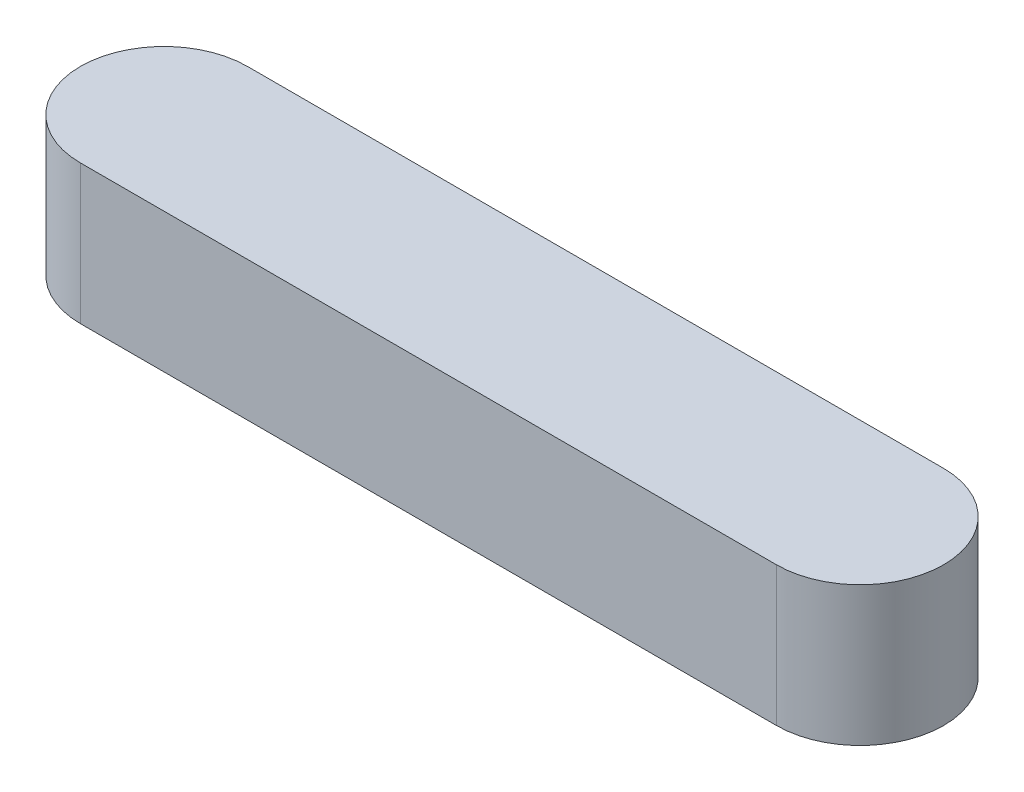
ISO-10303-21;
HEADER;
FILE_DESCRIPTION(('STEP AP214'),'2;1');
FILE_NAME('part.step','',(''),(''),'','','');
FILE_SCHEMA(('AUTOMOTIVE_DESIGN { 1 0 10303 214 1 1 1 1 }'));
ENDSEC;
DATA;
#1=APPLICATION_CONTEXT('core data for automotive mechanical design processes');
#2=APPLICATION_PROTOCOL_DEFINITION('international standard','automotive_design',2000,#1);
#3=PRODUCT_CONTEXT('',#1,'mechanical');
#4=PRODUCT('Part','Part','',(#3));
#5=PRODUCT_RELATED_PRODUCT_CATEGORY('part','',(#4));
#6=PRODUCT_DEFINITION_FORMATION('','',#4);
#7=PRODUCT_DEFINITION_CONTEXT('part definition',#1,'design');
#8=PRODUCT_DEFINITION('design','',#6,#7);
#9=PRODUCT_DEFINITION_SHAPE('','',#8);
#10=(LENGTH_UNIT() NAMED_UNIT(*) SI_UNIT(.MILLI.,.METRE.));
#11=(NAMED_UNIT(*) PLANE_ANGLE_UNIT() SI_UNIT($,.RADIAN.));
#12=(NAMED_UNIT(*) SI_UNIT($,.STERADIAN.) SOLID_ANGLE_UNIT());
#13=UNCERTAINTY_MEASURE_WITH_UNIT(LENGTH_MEASURE(1.E-05),#10,'distance_accuracy_value','');
#14=(GEOMETRIC_REPRESENTATION_CONTEXT(3) GLOBAL_UNCERTAINTY_ASSIGNED_CONTEXT((#13)) GLOBAL_UNIT_ASSIGNED_CONTEXT((#10,
#11,#12)) REPRESENTATION_CONTEXT('',''));
#15=CARTESIAN_POINT('',(0.,0.,0.));
#16=DIRECTION('',(0.,0.,1.));
#17=DIRECTION('',(1.,0.,0.));
#18=AXIS2_PLACEMENT_3D('',#15,#16,#17);
#19=CARTESIAN_POINT('',(-21.1780526384952,5.00000000000004,12.7728596341905));
#20=DIRECTION('',(0.,-1.,0.));
#21=DIRECTION('',(0.,0.,-1.));
#22=AXIS2_PLACEMENT_3D('',#19,#20,#21);
#23=CYLINDRICAL_SURFACE('',#22,3.);
#24=CARTESIAN_POINT('',(-21.1780526384952,0.,12.7728596341905));
#25=DIRECTION('',(0.,-1.,0.));
#26=DIRECTION('',(0.,0.,-1.));
#27=AXIS2_PLACEMENT_3D('',#24,#25,#26);
#28=CIRCLE('',#27,3.);
#29=CARTESIAN_POINT('',(-21.1780526384952,0.,9.77285963419047));
#30=VERTEX_POINT('',#29);
#31=CARTESIAN_POINT('',(-21.1780526384952,0.,15.7728596341905));
#32=VERTEX_POINT('',#31);
#33=EDGE_CURVE('E105',#30,#32,#28,.T.);
#34=ORIENTED_EDGE('',*,*,#33,.F.);
#35=DIRECTION('',(0.,-1.,0.));
#36=VECTOR('',#35,1.);
#37=CARTESIAN_POINT('',(-21.1780526384952,5.00000000000004,9.77285963419051));
#38=LINE('',#37,#36);
#39=CARTESIAN_POINT('',(-21.1780526384952,5.00000000000004,9.77285963419051));
#40=VERTEX_POINT('',#39);
#41=EDGE_CURVE('E13',#40,#30,#38,.T.);
#42=ORIENTED_EDGE('',*,*,#41,.F.);
#43=CARTESIAN_POINT('',(-21.1780526384952,5.00000000000004,12.7728596341905));
#44=DIRECTION('',(0.,-1.,0.));
#45=DIRECTION('',(0.,0.,-1.));
#46=AXIS2_PLACEMENT_3D('',#43,#44,#45);
#47=CIRCLE('',#46,3.);
#48=CARTESIAN_POINT('',(-21.1780526384952,5.00000000000004,15.7728596341905));
#49=VERTEX_POINT('',#48);
#50=EDGE_CURVE('E100',#40,#49,#47,.T.);
#51=ORIENTED_EDGE('',*,*,#50,.T.);
#52=DIRECTION('',(0.,-1.,0.));
#53=VECTOR('',#52,1.);
#54=CARTESIAN_POINT('',(-21.1780526384952,5.00000000000004,15.7728596341905));
#55=LINE('',#54,#53);
#56=EDGE_CURVE('E43',#49,#32,#55,.T.);
#57=ORIENTED_EDGE('',*,*,#56,.T.);
#58=EDGE_LOOP('',(#34,#42,#51,#57));
#59=FACE_BOUND('',#58,.T.);
#60=ADVANCED_FACE('F40',(#59),#23,.T.);
#61=CARTESIAN_POINT('',(-21.1780526384952,5.00000000000004,9.77285963419051));
#62=DIRECTION('',(0.,0.,1.));
#63=DIRECTION('',(1.,0.,0.));
#64=AXIS2_PLACEMENT_3D('',#61,#62,#63);
#65=PLANE('',#64);
#66=DIRECTION('',(-1.,0.,0.));
#67=VECTOR('',#66,1.);
#68=CARTESIAN_POINT('',(-21.1780526384952,0.,9.77285963419047));
#69=LINE('',#68,#67);
#70=CARTESIAN_POINT('',(-46.1780526384952,0.,9.77285963419047));
#71=VERTEX_POINT('',#70);
#72=EDGE_CURVE('E73',#30,#71,#69,.T.);
#73=ORIENTED_EDGE('',*,*,#72,.T.);
#74=DIRECTION('',(0.,-1.,0.));
#75=VECTOR('',#74,1.);
#76=CARTESIAN_POINT('',(-46.1780526384952,5.00000000000004,9.77285963419047));
#77=LINE('',#76,#75);
#78=CARTESIAN_POINT('',(-46.1780526384952,5.00000000000004,9.77285963419047));
#79=VERTEX_POINT('',#78);
#80=EDGE_CURVE('E49',#79,#71,#77,.T.);
#81=ORIENTED_EDGE('',*,*,#80,.F.);
#82=DIRECTION('',(-1.,0.,0.));
#83=VECTOR('',#82,1.);
#84=CARTESIAN_POINT('',(-21.1780526384952,5.00000000000004,9.77285963419051));
#85=LINE('',#84,#83);
#86=EDGE_CURVE('E90',#40,#79,#85,.T.);
#87=ORIENTED_EDGE('',*,*,#86,.F.);
#88=ORIENTED_EDGE('',*,*,#41,.T.);
#89=EDGE_LOOP('',(#73,#81,#87,#88));
#90=FACE_BOUND('',#89,.T.);
#91=ADVANCED_FACE('F115',(#90),#65,.F.);
#92=CARTESIAN_POINT('',(-46.1780526384952,5.00000000000004,12.7728596341905));
#93=DIRECTION('',(0.,-1.,0.));
#94=DIRECTION('',(0.,0.,-1.));
#95=AXIS2_PLACEMENT_3D('',#92,#93,#94);
#96=CYLINDRICAL_SURFACE('',#95,3.);
#97=CARTESIAN_POINT('',(-46.1780526384952,0.,12.7728596341905));
#98=DIRECTION('',(0.,1.,0.));
#99=DIRECTION('',(0.,0.,1.));
#100=AXIS2_PLACEMENT_3D('',#97,#98,#99);
#101=CIRCLE('',#100,3.);
#102=CARTESIAN_POINT('',(-46.1780526384952,0.,15.7728596341905));
#103=VERTEX_POINT('',#102);
#104=EDGE_CURVE('E97',#71,#103,#101,.T.);
#105=ORIENTED_EDGE('',*,*,#104,.T.);
#106=DIRECTION('',(0.,-1.,0.));
#107=VECTOR('',#106,1.);
#108=CARTESIAN_POINT('',(-46.1780526384952,5.00000000000004,15.7728596341906));
#109=LINE('',#108,#107);
#110=CARTESIAN_POINT('',(-46.1780526384952,5.00000000000004,15.7728596341906));
#111=VERTEX_POINT('',#110);
#112=EDGE_CURVE('E94',#111,#103,#109,.T.);
#113=ORIENTED_EDGE('',*,*,#112,.F.);
#114=CARTESIAN_POINT('',(-46.1780526384952,5.00000000000004,12.7728596341905));
#115=DIRECTION('',(0.,1.,0.));
#116=DIRECTION('',(0.,0.,1.));
#117=AXIS2_PLACEMENT_3D('',#114,#115,#116);
#118=CIRCLE('',#117,3.);
#119=EDGE_CURVE('E85',#79,#111,#118,.T.);
#120=ORIENTED_EDGE('',*,*,#119,.F.);
#121=ORIENTED_EDGE('',*,*,#80,.T.);
#122=EDGE_LOOP('',(#105,#113,#120,#121));
#123=FACE_BOUND('',#122,.T.);
#124=ADVANCED_FACE('F95',(#123),#96,.T.);
#125=CARTESIAN_POINT('',(-21.1780526384952,5.00000000000004,15.7728596341905));
#126=DIRECTION('',(0.,0.,1.));
#127=DIRECTION('',(1.,0.,0.));
#128=AXIS2_PLACEMENT_3D('',#125,#126,#127);
#129=PLANE('',#128);
#130=DIRECTION('',(-1.,0.,0.));
#131=VECTOR('',#130,1.);
#132=CARTESIAN_POINT('',(-21.1780526384952,0.,15.7728596341905));
#133=LINE('',#132,#131);
#134=EDGE_CURVE('E108',#32,#103,#133,.T.);
#135=ORIENTED_EDGE('',*,*,#134,.F.);
#136=ORIENTED_EDGE('',*,*,#56,.F.);
#137=DIRECTION('',(-1.,0.,0.));
#138=VECTOR('',#137,1.);
#139=CARTESIAN_POINT('',(-21.1780526384952,5.00000000000004,15.7728596341905));
#140=LINE('',#139,#138);
#141=EDGE_CURVE('E89',#49,#111,#140,.T.);
#142=ORIENTED_EDGE('',*,*,#141,.T.);
#143=ORIENTED_EDGE('',*,*,#112,.T.);
#144=EDGE_LOOP('',(#135,#136,#142,#143));
#145=FACE_BOUND('',#144,.T.);
#146=ADVANCED_FACE('F99',(#145),#129,.T.);
#147=CARTESIAN_POINT('',(-21.1780526384952,5.00000000000004,12.7728596341905));
#148=DIRECTION('',(0.,-1.,0.));
#149=DIRECTION('',(0.,0.,-1.));
#150=AXIS2_PLACEMENT_3D('',#147,#148,#149);
#151=PLANE('',#150);
#152=ORIENTED_EDGE('',*,*,#50,.F.);
#153=ORIENTED_EDGE('',*,*,#86,.T.);
#154=ORIENTED_EDGE('',*,*,#119,.T.);
#155=ORIENTED_EDGE('',*,*,#141,.F.);
#156=EDGE_LOOP('',(#152,#153,#154,#155));
#157=FACE_BOUND('',#156,.T.);
#158=ADVANCED_FACE('F88',(#157),#151,.F.);
#159=CARTESIAN_POINT('',(-21.1780526384952,0.,12.7728596341905));
#160=DIRECTION('',(0.,-1.,0.));
#161=DIRECTION('',(0.,0.,-1.));
#162=AXIS2_PLACEMENT_3D('',#159,#160,#161);
#163=PLANE('',#162);
#164=ORIENTED_EDGE('',*,*,#33,.T.);
#165=ORIENTED_EDGE('',*,*,#134,.T.);
#166=ORIENTED_EDGE('',*,*,#104,.F.);
#167=ORIENTED_EDGE('',*,*,#72,.F.);
#168=EDGE_LOOP('',(#164,#165,#166,#167));
#169=FACE_BOUND('',#168,.T.);
#170=ADVANCED_FACE('F113',(#169),#163,.T.);
#171=CLOSED_SHELL('',(#60,#91,#124,#146,#158,#170));
#172=MANIFOLD_SOLID_BREP('B2',#171);
#173=ADVANCED_BREP_SHAPE_REPRESENTATION('',(#18,#172),#14);
#174=SHAPE_DEFINITION_REPRESENTATION(#9,#173);
ENDSEC;
END-ISO-10303-21;
